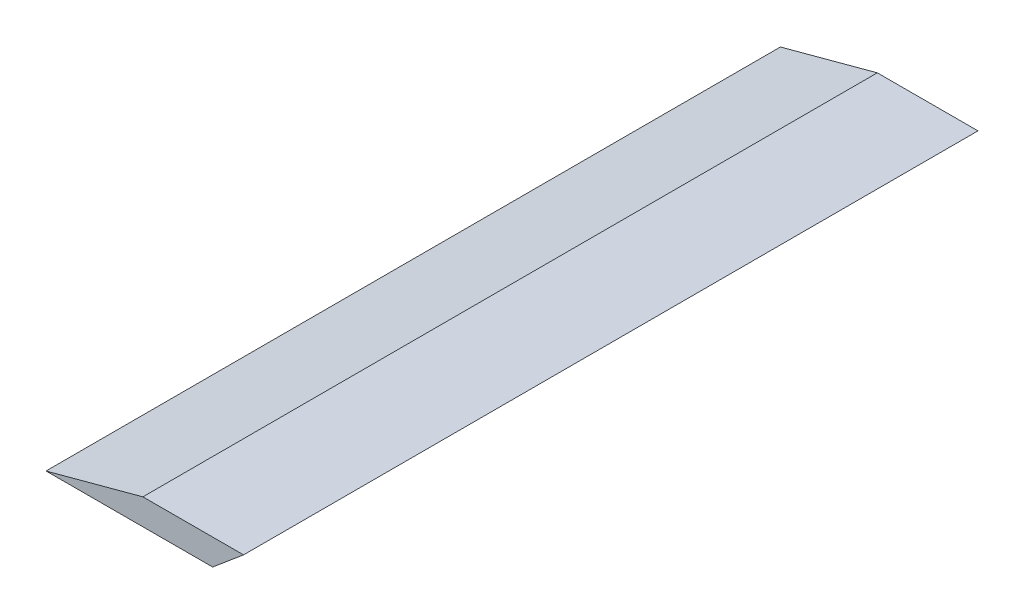
ISO-10303-21;
HEADER;
FILE_DESCRIPTION(('STEP AP214'),'2;1');
FILE_NAME('part.step','',(''),(''),'','','');
FILE_SCHEMA(('AUTOMOTIVE_DESIGN { 1 0 10303 214 1 1 1 1 }'));
ENDSEC;
DATA;
#1=APPLICATION_CONTEXT('core data for automotive mechanical design processes');
#2=APPLICATION_PROTOCOL_DEFINITION('international standard','automotive_design',2000,#1);
#3=PRODUCT_CONTEXT('',#1,'mechanical');
#4=PRODUCT('Part','Part','',(#3));
#5=PRODUCT_RELATED_PRODUCT_CATEGORY('part','',(#4));
#6=PRODUCT_DEFINITION_FORMATION('','',#4);
#7=PRODUCT_DEFINITION_CONTEXT('part definition',#1,'design');
#8=PRODUCT_DEFINITION('design','',#6,#7);
#9=PRODUCT_DEFINITION_SHAPE('','',#8);
#10=(LENGTH_UNIT() NAMED_UNIT(*) SI_UNIT(.MILLI.,.METRE.));
#11=(NAMED_UNIT(*) PLANE_ANGLE_UNIT() SI_UNIT($,.RADIAN.));
#12=(NAMED_UNIT(*) SI_UNIT($,.STERADIAN.) SOLID_ANGLE_UNIT());
#13=UNCERTAINTY_MEASURE_WITH_UNIT(LENGTH_MEASURE(1.E-05),#10,'distance_accuracy_value','');
#14=(GEOMETRIC_REPRESENTATION_CONTEXT(3) GLOBAL_UNCERTAINTY_ASSIGNED_CONTEXT((#13)) GLOBAL_UNIT_ASSIGNED_CONTEXT((#10,
#11,#12)) REPRESENTATION_CONTEXT('',''));
#15=CARTESIAN_POINT('',(0.,0.,0.));
#16=DIRECTION('',(0.,0.,1.));
#17=DIRECTION('',(1.,0.,0.));
#18=AXIS2_PLACEMENT_3D('',#15,#16,#17);
#19=CARTESIAN_POINT('',(-0.00613239029291217,6.91042552503994,0.));
#20=DIRECTION('',(-0.000887411036566035,0.999999606250749,0.));
#21=DIRECTION('',(-0.999999606250749,-0.000887411036566035,0.));
#22=AXIS2_PLACEMENT_3D('',#19,#20,#21);
#23=PLANE('',#22);
#24=DIRECTION('',(0.,0.,-1.));
#25=VECTOR('',#24,1.);
#26=CARTESIAN_POINT('',(54.6556640081484,6.95893302554224,0.));
#27=LINE('',#26,#25);
#28=CARTESIAN_POINT('',(54.6556640081484,6.95893302554224,198.));
#29=VERTEX_POINT('',#28);
#30=CARTESIAN_POINT('',(54.6556640081484,6.95893302554224,0.));
#31=VERTEX_POINT('',#30);
#32=EDGE_CURVE('E75',#29,#31,#27,.T.);
#33=ORIENTED_EDGE('',*,*,#32,.T.);
#34=DIRECTION('',(0.999999606250749,0.000887411036566035,0.));
#35=VECTOR('',#34,1.);
#36=CARTESIAN_POINT('',(-0.00613239029291217,6.91042552503994,0.));
#37=LINE('',#36,#35);
#38=CARTESIAN_POINT('',(27.5060511899038,6.93484015000228,0.));
#39=VERTEX_POINT('',#38);
#40=EDGE_CURVE('E79',#39,#31,#37,.T.);
#41=ORIENTED_EDGE('',*,*,#40,.F.);
#42=DIRECTION('',(0.,0.,1.));
#43=VECTOR('',#42,1.);
#44=CARTESIAN_POINT('',(27.5060511899038,6.93484015000228,198.));
#45=LINE('',#44,#43);
#46=CARTESIAN_POINT('',(27.5060511899038,6.93484015000228,198.));
#47=VERTEX_POINT('',#46);
#48=EDGE_CURVE('E85',#39,#47,#45,.T.);
#49=ORIENTED_EDGE('',*,*,#48,.T.);
#50=DIRECTION('',(0.999999606250749,0.000887411036566035,0.));
#51=VECTOR('',#50,1.);
#52=CARTESIAN_POINT('',(-0.00613239029291217,6.91042552503994,198.));
#53=LINE('',#52,#51);
#54=EDGE_CURVE('E81',#47,#29,#53,.T.);
#55=ORIENTED_EDGE('',*,*,#54,.T.);
#56=EDGE_LOOP('',(#33,#41,#49,#55));
#57=FACE_BOUND('',#56,.T.);
#58=ADVANCED_FACE('F37',(#57),#23,.T.);
#59=CARTESIAN_POINT('',(19.2025038630302,-22.8434537632309,0.));
#60=DIRECTION('',(0.643467152882724,-0.765473724670547,0.));
#61=DIRECTION('',(0.765473724670547,0.643467152882724,0.));
#62=AXIS2_PLACEMENT_3D('',#59,#60,#61);
#63=PLANE('',#62);
#64=ORIENTED_EDGE('',*,*,#32,.F.);
#65=DIRECTION('',(-0.765473724670547,-0.643467152882724,0.));
#66=VECTOR('',#65,1.);
#67=CARTESIAN_POINT('',(19.2025038630302,-22.8434537632309,198.));
#68=LINE('',#67,#66);
#69=CARTESIAN_POINT('',(46.3196040220095,-0.0484672452495536,198.));
#70=VERTEX_POINT('',#69);
#71=EDGE_CURVE('E104',#29,#70,#68,.T.);
#72=ORIENTED_EDGE('',*,*,#71,.T.);
#73=DIRECTION('',(0.,0.,-1.));
#74=VECTOR('',#73,1.);
#75=CARTESIAN_POINT('',(46.3196040220095,-0.048467245249554,198.));
#76=LINE('',#75,#74);
#77=CARTESIAN_POINT('',(46.3196040220095,-0.0484672452495536,0.));
#78=VERTEX_POINT('',#77);
#79=EDGE_CURVE('E89',#70,#78,#76,.T.);
#80=ORIENTED_EDGE('',*,*,#79,.T.);
#81=DIRECTION('',(-0.765473724670547,-0.643467152882724,0.));
#82=VECTOR('',#81,1.);
#83=CARTESIAN_POINT('',(19.2025038630302,-22.8434537632309,0.));
#84=LINE('',#83,#82);
#85=EDGE_CURVE('E41',#31,#78,#84,.T.);
#86=ORIENTED_EDGE('',*,*,#85,.F.);
#87=EDGE_LOOP('',(#64,#72,#80,#86));
#88=FACE_BOUND('',#87,.T.);
#89=ADVANCED_FACE('F87',(#88),#63,.T.);
#90=CARTESIAN_POINT('',(1.38791770062322,-0.0883401352825959,198.));
#91=DIRECTION('',(0.259676116431469,-0.9656957670794,0.));
#92=DIRECTION('',(0.9656957670794,0.25967611643147,0.));
#93=AXIS2_PLACEMENT_3D('',#90,#91,#92);
#94=PLANE('',#93);
#95=ORIENTED_EDGE('',*,*,#48,.F.);
#96=DIRECTION('',(-0.9656957670794,-0.259676116431469,0.));
#97=VECTOR('',#96,1.);
#98=CARTESIAN_POINT('',(1.38791770062322,-0.0883401352825959,0.));
#99=LINE('',#98,#97);
#100=CARTESIAN_POINT('',(1.38791770062322,-0.0883401352825959,0.));
#101=VERTEX_POINT('',#100);
#102=EDGE_CURVE('E11',#39,#101,#99,.T.);
#103=ORIENTED_EDGE('',*,*,#102,.T.);
#104=DIRECTION('',(0.,0.,-1.));
#105=VECTOR('',#104,1.);
#106=CARTESIAN_POINT('',(1.38791770062322,-0.0883401352825959,198.));
#107=LINE('',#106,#105);
#108=CARTESIAN_POINT('',(1.38791770062322,-0.0883401352825959,198.));
#109=VERTEX_POINT('',#108);
#110=EDGE_CURVE('E93',#109,#101,#107,.T.);
#111=ORIENTED_EDGE('',*,*,#110,.F.);
#112=DIRECTION('',(-0.9656957670794,-0.259676116431469,0.));
#113=VECTOR('',#112,1.);
#114=CARTESIAN_POINT('',(1.38791770062322,-0.0883401352825959,198.));
#115=LINE('',#114,#113);
#116=EDGE_CURVE('E102',#47,#109,#115,.T.);
#117=ORIENTED_EDGE('',*,*,#116,.F.);
#118=EDGE_LOOP('',(#95,#103,#111,#117));
#119=FACE_BOUND('',#118,.T.);
#120=ADVANCED_FACE('F111',(#119),#94,.F.);
#121=CARTESIAN_POINT('',(1.38791770062322,-0.0883401352825959,198.));
#122=DIRECTION('',(-0.000887411036566035,0.999999606250749,0.));
#123=DIRECTION('',(-0.999999606250749,-0.000887411036566035,0.));
#124=AXIS2_PLACEMENT_3D('',#121,#122,#123);
#125=PLANE('',#124);
#126=ORIENTED_EDGE('',*,*,#79,.F.);
#127=DIRECTION('',(0.999999606250748,0.000887411036566035,0.));
#128=VECTOR('',#127,1.);
#129=CARTESIAN_POINT('',(1.38791770062322,-0.0883401352825959,198.));
#130=LINE('',#129,#128);
#131=EDGE_CURVE('E96',#109,#70,#130,.T.);
#132=ORIENTED_EDGE('',*,*,#131,.F.);
#133=ORIENTED_EDGE('',*,*,#110,.T.);
#134=DIRECTION('',(0.999999606250748,0.000887411036566035,0.));
#135=VECTOR('',#134,1.);
#136=CARTESIAN_POINT('',(1.38791770062322,-0.0883401352825959,0.));
#137=LINE('',#136,#135);
#138=EDGE_CURVE('E47',#101,#78,#137,.T.);
#139=ORIENTED_EDGE('',*,*,#138,.T.);
#140=EDGE_LOOP('',(#126,#132,#133,#139));
#141=FACE_BOUND('',#140,.T.);
#142=ADVANCED_FACE('F110',(#141),#125,.F.);
#143=CARTESIAN_POINT('',(0.,0.,198.));
#144=DIRECTION('',(0.,0.,-1.));
#145=DIRECTION('',(-1.,0.,0.));
#146=AXIS2_PLACEMENT_3D('',#143,#144,#145);
#147=PLANE('',#146);
#148=ORIENTED_EDGE('',*,*,#71,.F.);
#149=ORIENTED_EDGE('',*,*,#54,.F.);
#150=ORIENTED_EDGE('',*,*,#116,.T.);
#151=ORIENTED_EDGE('',*,*,#131,.T.);
#152=EDGE_LOOP('',(#148,#149,#150,#151));
#153=FACE_BOUND('',#152,.T.);
#154=ADVANCED_FACE('F39',(#153),#147,.F.);
#155=CARTESIAN_POINT('',(0.,0.,0.));
#156=DIRECTION('',(0.,0.,-1.));
#157=DIRECTION('',(-1.,0.,0.));
#158=AXIS2_PLACEMENT_3D('',#155,#156,#157);
#159=PLANE('',#158);
#160=ORIENTED_EDGE('',*,*,#40,.T.);
#161=ORIENTED_EDGE('',*,*,#85,.T.);
#162=ORIENTED_EDGE('',*,*,#138,.F.);
#163=ORIENTED_EDGE('',*,*,#102,.F.);
#164=EDGE_LOOP('',(#160,#161,#162,#163));
#165=FACE_BOUND('',#164,.T.);
#166=ADVANCED_FACE('F92',(#165),#159,.T.);
#167=CLOSED_SHELL('',(#58,#89,#120,#142,#154,#166));
#168=MANIFOLD_SOLID_BREP('B2',#167);
#169=ADVANCED_BREP_SHAPE_REPRESENTATION('',(#18,#168),#14);
#170=SHAPE_DEFINITION_REPRESENTATION(#9,#169);
ENDSEC;
END-ISO-10303-21;
